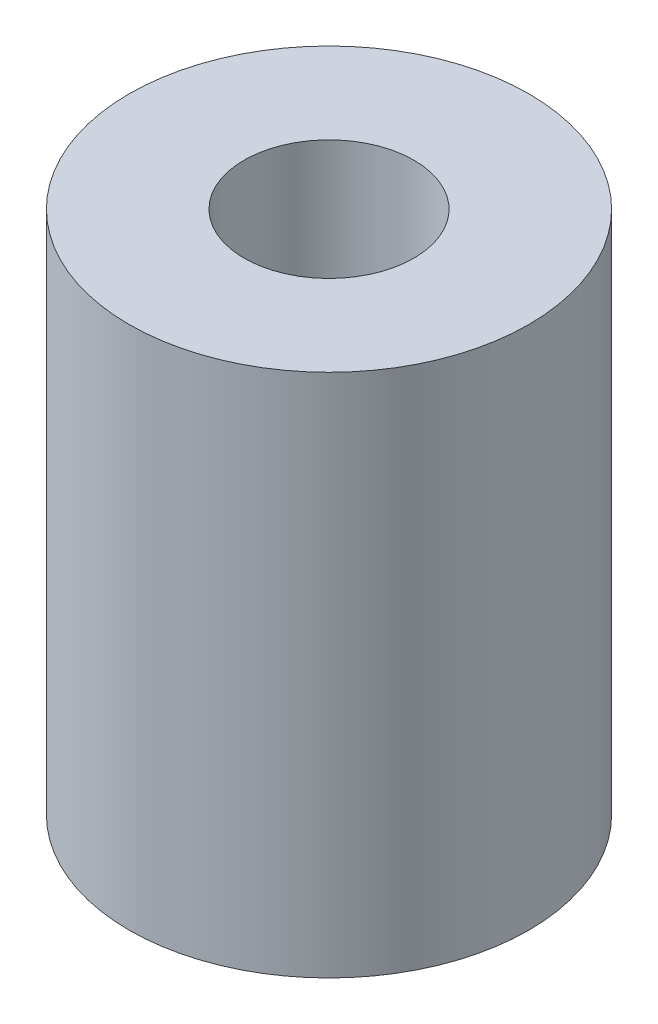
ISO-10303-21;
HEADER;
FILE_DESCRIPTION(('STEP AP214'),'2;1');
FILE_NAME('part.step','',(''),(''),'','','');
FILE_SCHEMA(('AUTOMOTIVE_DESIGN { 1 0 10303 214 1 1 1 1 }'));
ENDSEC;
DATA;
#1=APPLICATION_CONTEXT('core data for automotive mechanical design processes');
#2=APPLICATION_PROTOCOL_DEFINITION('international standard','automotive_design',2000,#1);
#3=PRODUCT_CONTEXT('',#1,'mechanical');
#4=PRODUCT('Part','Part','',(#3));
#5=PRODUCT_RELATED_PRODUCT_CATEGORY('part','',(#4));
#6=PRODUCT_DEFINITION_FORMATION('','',#4);
#7=PRODUCT_DEFINITION_CONTEXT('part definition',#1,'design');
#8=PRODUCT_DEFINITION('design','',#6,#7);
#9=PRODUCT_DEFINITION_SHAPE('','',#8);
#10=(LENGTH_UNIT() NAMED_UNIT(*) SI_UNIT(.MILLI.,.METRE.));
#11=(NAMED_UNIT(*) PLANE_ANGLE_UNIT() SI_UNIT($,.RADIAN.));
#12=(NAMED_UNIT(*) SI_UNIT($,.STERADIAN.) SOLID_ANGLE_UNIT());
#13=UNCERTAINTY_MEASURE_WITH_UNIT(LENGTH_MEASURE(1.E-05),#10,'distance_accuracy_value','');
#14=(GEOMETRIC_REPRESENTATION_CONTEXT(3) GLOBAL_UNCERTAINTY_ASSIGNED_CONTEXT((#13)) GLOBAL_UNIT_ASSIGNED_CONTEXT((#10,
#11,#12)) REPRESENTATION_CONTEXT('',''));
#15=CARTESIAN_POINT('',(0.,0.,0.));
#16=DIRECTION('',(0.,0.,1.));
#17=DIRECTION('',(1.,0.,0.));
#18=AXIS2_PLACEMENT_3D('',#15,#16,#17);
#19=CARTESIAN_POINT('',(0.,10.5,0.));
#20=DIRECTION('',(0.,-1.,0.));
#21=DIRECTION('',(0.,0.,-1.));
#22=AXIS2_PLACEMENT_3D('',#19,#20,#21);
#23=CYLINDRICAL_SURFACE('',#22,4.);
#24=CARTESIAN_POINT('',(0.,10.5,0.));
#25=DIRECTION('',(0.,1.,0.));
#26=DIRECTION('',(0.,0.,1.));
#27=AXIS2_PLACEMENT_3D('',#24,#25,#26);
#28=CIRCLE('',#27,4.);
#29=CARTESIAN_POINT('',(0.,10.5,-4.));
#30=VERTEX_POINT('',#29);
#31=EDGE_CURVE('E10',#30,#30,#28,.T.);
#32=CARTESIAN_POINT('',(0.,0.,0.));
#33=DIRECTION('',(0.,1.,0.));
#34=DIRECTION('',(0.,0.,1.));
#35=AXIS2_PLACEMENT_3D('',#32,#33,#34);
#36=CIRCLE('',#35,4.);
#37=CARTESIAN_POINT('',(0.,0.,-4.));
#38=VERTEX_POINT('',#37);
#39=EDGE_CURVE('E38',#38,#38,#36,.T.);
#40=CARTESIAN_POINT('',(0.,10.5,-4.));
#41=CARTESIAN_POINT('',(0.,10.390625,-4.));
#42=CARTESIAN_POINT('',(0.,10.28125,-4.));
#43=CARTESIAN_POINT('',(0.,10.0625,-4.));
#44=CARTESIAN_POINT('',(0.,9.953125,-4.));
#45=CARTESIAN_POINT('',(0.,9.734375,-4.));
#46=CARTESIAN_POINT('',(0.,9.625,-4.));
#47=CARTESIAN_POINT('',(0.,9.40625,-4.));
#48=CARTESIAN_POINT('',(0.,9.296875,-4.));
#49=CARTESIAN_POINT('',(0.,9.078125,-4.));
#50=CARTESIAN_POINT('',(0.,8.96875,-4.));
#51=CARTESIAN_POINT('',(0.,8.75,-4.));
#52=CARTESIAN_POINT('',(0.,8.640625,-4.));
#53=CARTESIAN_POINT('',(0.,8.421875,-4.));
#54=CARTESIAN_POINT('',(0.,8.3125,-4.));
#55=CARTESIAN_POINT('',(0.,8.09375,-4.));
#56=CARTESIAN_POINT('',(0.,7.984375,-4.));
#57=CARTESIAN_POINT('',(0.,7.765625,-4.));
#58=CARTESIAN_POINT('',(0.,7.65625,-4.));
#59=CARTESIAN_POINT('',(0.,7.4375,-4.));
#60=CARTESIAN_POINT('',(0.,7.328125,-4.));
#61=CARTESIAN_POINT('',(0.,7.109375,-4.));
#62=CARTESIAN_POINT('',(0.,7.,-4.));
#63=CARTESIAN_POINT('',(0.,6.78125,-4.));
#64=CARTESIAN_POINT('',(0.,6.671875,-4.));
#65=CARTESIAN_POINT('',(0.,6.453125,-4.));
#66=CARTESIAN_POINT('',(0.,6.34375,-4.));
#67=CARTESIAN_POINT('',(0.,6.125,-4.));
#68=CARTESIAN_POINT('',(0.,6.015625,-4.));
#69=CARTESIAN_POINT('',(0.,5.796875,-4.));
#70=CARTESIAN_POINT('',(0.,5.6875,-4.));
#71=CARTESIAN_POINT('',(0.,5.46875,-4.));
#72=CARTESIAN_POINT('',(0.,5.359375,-4.));
#73=CARTESIAN_POINT('',(0.,5.140625,-4.));
#74=CARTESIAN_POINT('',(0.,5.03125,-4.));
#75=CARTESIAN_POINT('',(0.,4.8125,-4.));
#76=CARTESIAN_POINT('',(0.,4.703125,-4.));
#77=CARTESIAN_POINT('',(0.,4.484375,-4.));
#78=CARTESIAN_POINT('',(0.,4.375,-4.));
#79=CARTESIAN_POINT('',(0.,4.15625,-4.));
#80=CARTESIAN_POINT('',(0.,4.046875,-4.));
#81=CARTESIAN_POINT('',(0.,3.828125,-4.));
#82=CARTESIAN_POINT('',(0.,3.71875,-4.));
#83=CARTESIAN_POINT('',(0.,3.5,-4.));
#84=CARTESIAN_POINT('',(0.,3.390625,-4.));
#85=CARTESIAN_POINT('',(0.,3.171875,-4.));
#86=CARTESIAN_POINT('',(0.,3.0625,-4.));
#87=CARTESIAN_POINT('',(0.,2.84375,-4.));
#88=CARTESIAN_POINT('',(0.,2.734375,-4.));
#89=CARTESIAN_POINT('',(0.,2.515625,-4.));
#90=CARTESIAN_POINT('',(0.,2.40625,-4.));
#91=CARTESIAN_POINT('',(0.,2.1875,-4.));
#92=CARTESIAN_POINT('',(0.,2.078125,-4.));
#93=CARTESIAN_POINT('',(0.,1.859375,-4.));
#94=CARTESIAN_POINT('',(0.,1.75,-4.));
#95=CARTESIAN_POINT('',(0.,1.53125,-4.));
#96=CARTESIAN_POINT('',(0.,1.421875,-4.));
#97=CARTESIAN_POINT('',(0.,1.203125,-4.));
#98=CARTESIAN_POINT('',(0.,1.09375,-4.));
#99=CARTESIAN_POINT('',(0.,0.875000000000001,-4.));
#100=CARTESIAN_POINT('',(0.,0.765625000000001,-4.));
#101=CARTESIAN_POINT('',(0.,0.546875,-4.));
#102=CARTESIAN_POINT('',(0.,0.4375,-4.));
#103=CARTESIAN_POINT('',(0.,0.21875,-4.));
#104=CARTESIAN_POINT('',(0.,0.109375,-4.));
#105=CARTESIAN_POINT('',(0.,0.,-4.));
#106=B_SPLINE_CURVE_WITH_KNOTS('',3,(#40,#41,#42,#43,#44,#45,#46,#47,#48,#49,#50,#51,#52,#53,
#54,#55,#56,#57,#58,#59,#60,#61,#62,#63,#64,#65,#66,#67,#68,#69,#70,#71,#72,#73,#74,#75,#76,#77,
#78,#79,#80,#81,#82,#83,#84,#85,#86,#87,#88,#89,#90,#91,#92,#93,#94,#95,#96,#97,#98,#99,#100,
#101,#102,#103,#104,#105),.UNSPECIFIED.,.F.,.F.,(4,2,2,2,2,2,2,2,2,2,2,2,2,2,2,2,2,2,2,2,2,2,2,
2,2,2,2,2,2,2,2,2,4),(0.,0.328124999999999,0.656249999999999,0.984374999999999,1.3125,1.640625,
1.96875,2.296875,2.625,2.953125,3.28125,3.609375,3.9375,4.265625,4.59375,4.921875,5.25,5.578125,
5.90625,6.234375,6.5625,6.890625,7.21875,7.546875,7.875,8.203125,8.53125,8.859375,9.1875,
9.515625,9.84375,10.171875,10.5),.UNSPECIFIED.);
#107=EDGE_CURVE('BSEAM35',#30,#38,#106,.T.);
#108=ORIENTED_EDGE('',*,*,#31,.F.);
#109=ORIENTED_EDGE('',*,*,#39,.T.);
#110=ORIENTED_EDGE('',*,*,#107,.T.);
#111=ORIENTED_EDGE('',*,*,#107,.F.);
#112=EDGE_LOOP('',(#108,#110,#109,#111));
#113=FACE_BOUND('',#112,.T.);
#114=ADVANCED_FACE('F35',(#113),#23,.T.);
#115=CARTESIAN_POINT('',(0.,10.5,0.));
#116=DIRECTION('',(0.,1.,0.));
#117=DIRECTION('',(0.,0.,1.));
#118=AXIS2_PLACEMENT_3D('',#115,#116,#117);
#119=PLANE('',#118);
#120=CARTESIAN_POINT('',(0.,10.5,0.));
#121=DIRECTION('',(0.,-1.,0.));
#122=DIRECTION('',(0.,0.,-1.));
#123=AXIS2_PLACEMENT_3D('',#120,#121,#122);
#124=CIRCLE('',#123,1.7);
#125=CARTESIAN_POINT('',(0.,10.5,-1.7));
#126=VERTEX_POINT('',#125);
#127=EDGE_CURVE('E45',#126,#126,#124,.T.);
#128=ORIENTED_EDGE('',*,*,#127,.T.);
#129=EDGE_LOOP('',(#128));
#130=FACE_BOUND('',#129,.T.);
#131=ORIENTED_EDGE('',*,*,#31,.T.);
#132=EDGE_LOOP('',(#131));
#133=FACE_BOUND('',#132,.T.);
#134=ADVANCED_FACE('F58',(#130,#133),#119,.T.);
#135=CARTESIAN_POINT('',(0.,0.,0.));
#136=DIRECTION('',(0.,1.,0.));
#137=DIRECTION('',(0.,0.,1.));
#138=AXIS2_PLACEMENT_3D('',#135,#136,#137);
#139=PLANE('',#138);
#140=CARTESIAN_POINT('',(0.,0.,0.));
#141=DIRECTION('',(0.,-1.,0.));
#142=DIRECTION('',(0.,0.,-1.));
#143=AXIS2_PLACEMENT_3D('',#140,#141,#142);
#144=CIRCLE('',#143,1.69999999999999);
#145=CARTESIAN_POINT('',(0.,0.,-1.69999999999999));
#146=VERTEX_POINT('',#145);
#147=EDGE_CURVE('E49',#146,#146,#144,.T.);
#148=ORIENTED_EDGE('',*,*,#147,.F.);
#149=EDGE_LOOP('',(#148));
#150=FACE_BOUND('',#149,.T.);
#151=ORIENTED_EDGE('',*,*,#39,.F.);
#152=EDGE_LOOP('',(#151));
#153=FACE_BOUND('',#152,.T.);
#154=ADVANCED_FACE('F55',(#150,#153),#139,.F.);
#155=CARTESIAN_POINT('',(0.,0.,0.));
#156=DIRECTION('',(0.,-1.,0.));
#157=DIRECTION('',(0.,0.,-1.));
#158=AXIS2_PLACEMENT_3D('',#155,#156,#157);
#159=CYLINDRICAL_SURFACE('',#158,1.69999999999999);
#160=ORIENTED_EDGE('',*,*,#127,.F.);
#161=EDGE_LOOP('',(#160));
#162=FACE_BOUND('',#161,.T.);
#163=ORIENTED_EDGE('',*,*,#147,.T.);
#164=EDGE_LOOP('',(#163));
#165=FACE_BOUND('',#164,.T.);
#166=ADVANCED_FACE('F53',(#162,#165),#159,.F.);
#167=CLOSED_SHELL('',(#114,#134,#154,#166));
#168=MANIFOLD_SOLID_BREP('B2',#167);
#169=ADVANCED_BREP_SHAPE_REPRESENTATION('',(#18,#168),#14);
#170=SHAPE_DEFINITION_REPRESENTATION(#9,#169);
ENDSEC;
END-ISO-10303-21;
